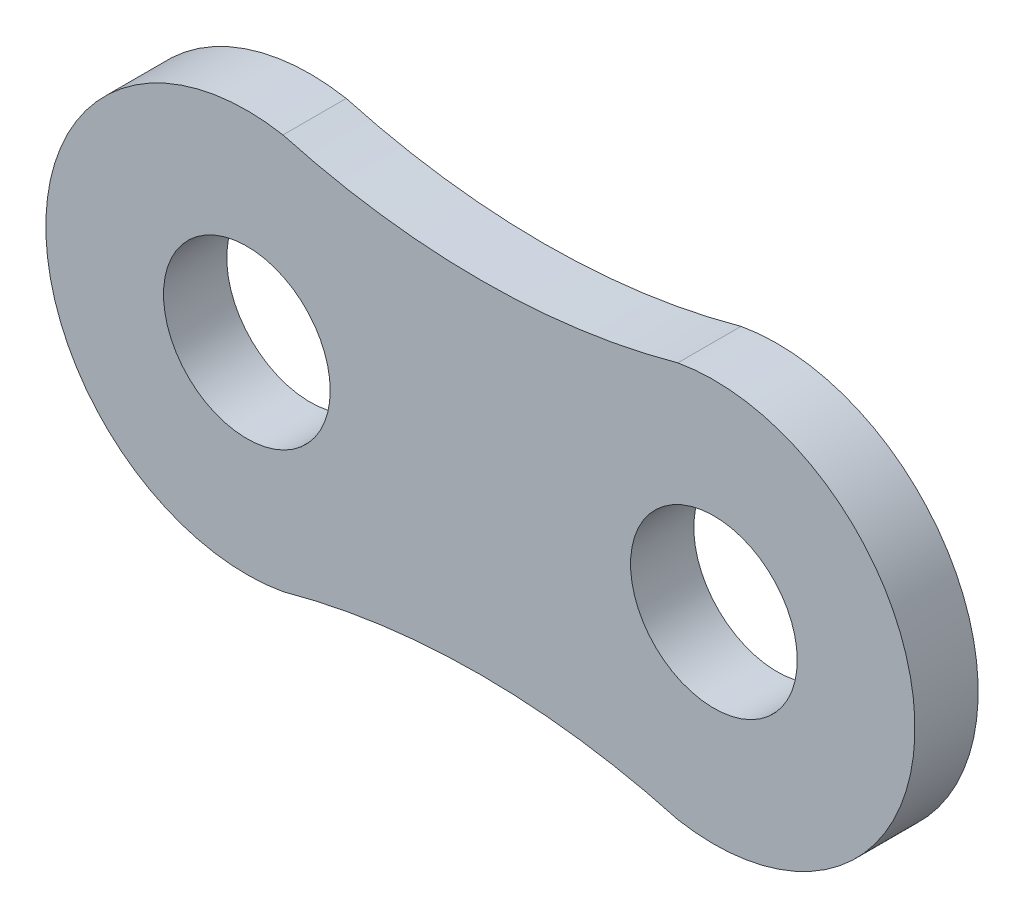
ISO-10303-21;
HEADER;
FILE_DESCRIPTION(('STEP AP214'),'2;1');
FILE_NAME('part.step','',(''),(''),'','','');
FILE_SCHEMA(('AUTOMOTIVE_DESIGN { 1 0 10303 214 1 1 1 1 }'));
ENDSEC;
DATA;
#1=APPLICATION_CONTEXT('core data for automotive mechanical design processes');
#2=APPLICATION_PROTOCOL_DEFINITION('international standard','automotive_design',2000,#1);
#3=PRODUCT_CONTEXT('',#1,'mechanical');
#4=PRODUCT('Part','Part','',(#3));
#5=PRODUCT_RELATED_PRODUCT_CATEGORY('part','',(#4));
#6=PRODUCT_DEFINITION_FORMATION('','',#4);
#7=PRODUCT_DEFINITION_CONTEXT('part definition',#1,'design');
#8=PRODUCT_DEFINITION('design','',#6,#7);
#9=PRODUCT_DEFINITION_SHAPE('','',#8);
#10=(LENGTH_UNIT() NAMED_UNIT(*) SI_UNIT(.MILLI.,.METRE.));
#11=(NAMED_UNIT(*) PLANE_ANGLE_UNIT() SI_UNIT($,.RADIAN.));
#12=(NAMED_UNIT(*) SI_UNIT($,.STERADIAN.) SOLID_ANGLE_UNIT());
#13=UNCERTAINTY_MEASURE_WITH_UNIT(LENGTH_MEASURE(1.E-05),#10,'distance_accuracy_value','');
#14=(GEOMETRIC_REPRESENTATION_CONTEXT(3) GLOBAL_UNCERTAINTY_ASSIGNED_CONTEXT((#13)) GLOBAL_UNIT_ASSIGNED_CONTEXT((#10,
#11,#12)) REPRESENTATION_CONTEXT('',''));
#15=CARTESIAN_POINT('',(0.,0.,0.));
#16=DIRECTION('',(0.,0.,1.));
#17=DIRECTION('',(1.,0.,0.));
#18=AXIS2_PLACEMENT_3D('',#15,#16,#17);
#19=CARTESIAN_POINT('',(4.025961325029,-4.033300234333,-4.15));
#20=DIRECTION('',(0.,0.,1.));
#21=DIRECTION('',(1.,0.,0.));
#22=AXIS2_PLACEMENT_3D('',#19,#20,#21);
#23=PLANE('',#22);
#24=CARTESIAN_POINT('',(-4.7625,0.,-4.15));
#25=DIRECTION('',(0.,0.,1.));
#26=DIRECTION('',(1.,0.,0.));
#27=AXIS2_PLACEMENT_3D('',#24,#25,#26);
#28=CIRCLE('',#27,1.7);
#29=CARTESIAN_POINT('',(-3.0625,0.,-4.15));
#30=VERTEX_POINT('',#29);
#31=EDGE_CURVE('E118',#30,#30,#28,.T.);
#32=ORIENTED_EDGE('',*,*,#31,.T.);
#33=EDGE_LOOP('',(#32));
#34=FACE_BOUND('',#33,.T.);
#35=CARTESIAN_POINT('',(4.7625,0.,-4.15));
#36=DIRECTION('',(0.,0.,1.));
#37=DIRECTION('',(1.,0.,0.));
#38=AXIS2_PLACEMENT_3D('',#35,#36,#37);
#39=CIRCLE('',#38,1.7);
#40=CARTESIAN_POINT('',(6.4625,0.,-4.15));
#41=VERTEX_POINT('',#40);
#42=EDGE_CURVE('E88',#41,#41,#39,.T.);
#43=ORIENTED_EDGE('',*,*,#42,.T.);
#44=EDGE_LOOP('',(#43));
#45=FACE_BOUND('',#44,.T.);
#46=CARTESIAN_POINT('',(-4.7625,0.,-4.15));
#47=DIRECTION('',(0.,0.,1.));
#48=DIRECTION('',(1.,0.,0.));
#49=AXIS2_PLACEMENT_3D('',#46,#47,#48);
#50=CIRCLE('',#49,4.1);
#51=CARTESIAN_POINT('',(-4.02596132500836,4.03330023432939,-4.15));
#52=VERTEX_POINT('',#51);
#53=CARTESIAN_POINT('',(-4.02596132505139,-4.03330023433415,-4.15));
#54=VERTEX_POINT('',#53);
#55=EDGE_CURVE('E80',#52,#54,#50,.T.);
#56=ORIENTED_EDGE('',*,*,#55,.F.);
#57=CARTESIAN_POINT('',(-3.241851231905E-13,18.547765210198,-4.15));
#58=DIRECTION('',(0.,0.,1.));
#59=DIRECTION('',(1.,0.,0.));
#60=AXIS2_PLACEMENT_3D('',#57,#58,#59);
#61=CIRCLE('',#60,15.062471846485);
#62=CARTESIAN_POINT('',(4.02596132500672,4.03330023432994,-4.15));
#63=VERTEX_POINT('',#62);
#64=EDGE_CURVE('E68',#52,#63,#61,.T.);
#65=ORIENTED_EDGE('',*,*,#64,.T.);
#66=CARTESIAN_POINT('',(4.7625,0.,-4.15));
#67=DIRECTION('',(0.,0.,1.));
#68=DIRECTION('',(1.,0.,0.));
#69=AXIS2_PLACEMENT_3D('',#66,#67,#68);
#70=CIRCLE('',#69,4.1);
#71=CARTESIAN_POINT('',(4.02596132505441,-4.03330023433516,-4.15));
#72=VERTEX_POINT('',#71);
#73=EDGE_CURVE('E19',#72,#63,#70,.T.);
#74=ORIENTED_EDGE('',*,*,#73,.F.);
#75=CARTESIAN_POINT('',(-3.233650580253E-13,-18.54776521019,-4.15));
#76=DIRECTION('',(0.,0.,1.));
#77=DIRECTION('',(1.,0.,0.));
#78=AXIS2_PLACEMENT_3D('',#75,#76,#77);
#79=CIRCLE('',#78,15.062471846485);
#80=EDGE_CURVE('E67',#72,#54,#79,.T.);
#81=ORIENTED_EDGE('',*,*,#80,.T.);
#82=EDGE_LOOP('',(#56,#65,#74,#81));
#83=FACE_BOUND('',#82,.T.);
#84=ADVANCED_FACE('F16',(#34,#45,#83),#23,.F.);
#85=CARTESIAN_POINT('',(4.7625,0.,-2.86));
#86=DIRECTION('',(0.,0.,1.));
#87=DIRECTION('',(1.,0.,0.));
#88=AXIS2_PLACEMENT_3D('',#85,#86,#87);
#89=CYLINDRICAL_SURFACE('',#88,4.1);
#90=DIRECTION('',(0.,0.,1.));
#91=VECTOR('',#90,1.);
#92=CARTESIAN_POINT('',(4.02596132501561,4.0333002343324,-2.86));
#93=LINE('',#92,#91);
#94=CARTESIAN_POINT('',(4.02596132500672,4.03330023432994,-2.86));
#95=VERTEX_POINT('',#94);
#96=EDGE_CURVE('E96',#63,#95,#93,.T.);
#97=ORIENTED_EDGE('',*,*,#96,.T.);
#98=CARTESIAN_POINT('',(4.7625,0.,-2.86));
#99=DIRECTION('',(0.,0.,1.));
#100=DIRECTION('',(1.,0.,0.));
#101=AXIS2_PLACEMENT_3D('',#98,#99,#100);
#102=CIRCLE('',#101,4.1);
#103=CARTESIAN_POINT('',(4.02596132505441,-4.03330023433516,-2.86));
#104=VERTEX_POINT('',#103);
#105=EDGE_CURVE('E76',#104,#95,#102,.T.);
#106=ORIENTED_EDGE('',*,*,#105,.F.);
#107=DIRECTION('',(0.,0.,1.));
#108=VECTOR('',#107,1.);
#109=CARTESIAN_POINT('',(4.02596132502654,-4.03330023432744,-2.86));
#110=LINE('',#109,#108);
#111=EDGE_CURVE('E73',#104,#72,#110,.F.);
#112=ORIENTED_EDGE('',*,*,#111,.T.);
#113=ORIENTED_EDGE('',*,*,#73,.T.);
#114=EDGE_LOOP('',(#97,#106,#112,#113));
#115=FACE_BOUND('',#114,.T.);
#116=ADVANCED_FACE('F74',(#115),#89,.T.);
#117=CARTESIAN_POINT('',(-3.241851231905E-13,18.547765210198,-2.86));
#118=DIRECTION('',(0.,0.,1.));
#119=DIRECTION('',(1.,0.,0.));
#120=AXIS2_PLACEMENT_3D('',#117,#118,#119);
#121=CYLINDRICAL_SURFACE('',#120,15.062471846485);
#122=ORIENTED_EDGE('',*,*,#96,.F.);
#123=ORIENTED_EDGE('',*,*,#64,.F.);
#124=DIRECTION('',(0.,0.,1.));
#125=VECTOR('',#124,1.);
#126=CARTESIAN_POINT('',(-4.025961325017,4.03330023433097,-2.86));
#127=LINE('',#126,#125);
#128=CARTESIAN_POINT('',(-4.02596132500837,4.0333002343294,-2.86));
#129=VERTEX_POINT('',#128);
#130=EDGE_CURVE('E94',#129,#52,#127,.F.);
#131=ORIENTED_EDGE('',*,*,#130,.F.);
#132=CARTESIAN_POINT('',(-3.241851231905E-13,18.547765210198,-2.86));
#133=DIRECTION('',(0.,0.,1.));
#134=DIRECTION('',(1.,0.,0.));
#135=AXIS2_PLACEMENT_3D('',#132,#133,#134);
#136=CIRCLE('',#135,15.062471846485);
#137=EDGE_CURVE('E114',#95,#129,#136,.F.);
#138=ORIENTED_EDGE('',*,*,#137,.F.);
#139=EDGE_LOOP('',(#122,#123,#131,#138));
#140=FACE_BOUND('',#139,.T.);
#141=ADVANCED_FACE('F142',(#140),#121,.F.);
#142=CARTESIAN_POINT('',(-4.7625,0.,-2.86));
#143=DIRECTION('',(0.,0.,1.));
#144=DIRECTION('',(1.,0.,0.));
#145=AXIS2_PLACEMENT_3D('',#142,#143,#144);
#146=CYLINDRICAL_SURFACE('',#145,4.1);
#147=DIRECTION('',(0.,0.,1.));
#148=VECTOR('',#147,1.);
#149=CARTESIAN_POINT('',(-4.02596132501865,-4.03330023432506,-2.86));
#150=LINE('',#149,#148);
#151=CARTESIAN_POINT('',(-4.02596132505139,-4.03330023433415,-2.86));
#152=VERTEX_POINT('',#151);
#153=EDGE_CURVE('E38',#54,#152,#150,.T.);
#154=ORIENTED_EDGE('',*,*,#153,.T.);
#155=CARTESIAN_POINT('',(-4.7625,0.,-2.86));
#156=DIRECTION('',(0.,0.,1.));
#157=DIRECTION('',(1.,0.,0.));
#158=AXIS2_PLACEMENT_3D('',#155,#156,#157);
#159=CIRCLE('',#158,4.1);
#160=EDGE_CURVE('E110',#129,#152,#159,.T.);
#161=ORIENTED_EDGE('',*,*,#160,.F.);
#162=ORIENTED_EDGE('',*,*,#130,.T.);
#163=ORIENTED_EDGE('',*,*,#55,.T.);
#164=EDGE_LOOP('',(#154,#161,#162,#163));
#165=FACE_BOUND('',#164,.T.);
#166=ADVANCED_FACE('F140',(#165),#146,.T.);
#167=CARTESIAN_POINT('',(-3.233650580253E-13,-18.54776521019,-2.86));
#168=DIRECTION('',(0.,0.,1.));
#169=DIRECTION('',(1.,0.,0.));
#170=AXIS2_PLACEMENT_3D('',#167,#168,#169);
#171=CYLINDRICAL_SURFACE('',#170,15.062471846485);
#172=ORIENTED_EDGE('',*,*,#153,.F.);
#173=ORIENTED_EDGE('',*,*,#80,.F.);
#174=ORIENTED_EDGE('',*,*,#111,.F.);
#175=CARTESIAN_POINT('',(-3.233650580253E-13,-18.54776521019,-2.86));
#176=DIRECTION('',(0.,0.,1.));
#177=DIRECTION('',(1.,0.,0.));
#178=AXIS2_PLACEMENT_3D('',#175,#176,#177);
#179=CIRCLE('',#178,15.062471846485);
#180=EDGE_CURVE('E108',#152,#104,#179,.F.);
#181=ORIENTED_EDGE('',*,*,#180,.F.);
#182=EDGE_LOOP('',(#172,#173,#174,#181));
#183=FACE_BOUND('',#182,.T.);
#184=ADVANCED_FACE('F82',(#183),#171,.F.);
#185=CARTESIAN_POINT('',(4.7625,0.,-2.86));
#186=DIRECTION('',(0.,0.,1.));
#187=DIRECTION('',(1.,0.,0.));
#188=AXIS2_PLACEMENT_3D('',#185,#186,#187);
#189=CYLINDRICAL_SURFACE('',#188,1.7);
#190=ORIENTED_EDGE('',*,*,#42,.F.);
#191=EDGE_LOOP('',(#190));
#192=FACE_BOUND('',#191,.T.);
#193=CARTESIAN_POINT('',(4.7625,0.,-2.86));
#194=DIRECTION('',(0.,0.,1.));
#195=DIRECTION('',(1.,0.,0.));
#196=AXIS2_PLACEMENT_3D('',#193,#194,#195);
#197=CIRCLE('',#196,1.7);
#198=CARTESIAN_POINT('',(6.4625,0.,-2.86));
#199=VERTEX_POINT('',#198);
#200=EDGE_CURVE('E26',#199,#199,#197,.F.);
#201=ORIENTED_EDGE('',*,*,#200,.F.);
#202=EDGE_LOOP('',(#201));
#203=FACE_BOUND('',#202,.T.);
#204=ADVANCED_FACE('F128',(#192,#203),#189,.F.);
#205=CARTESIAN_POINT('',(-4.7625,0.,-2.86));
#206=DIRECTION('',(0.,0.,1.));
#207=DIRECTION('',(1.,0.,0.));
#208=AXIS2_PLACEMENT_3D('',#205,#206,#207);
#209=CYLINDRICAL_SURFACE('',#208,1.7);
#210=ORIENTED_EDGE('',*,*,#31,.F.);
#211=EDGE_LOOP('',(#210));
#212=FACE_BOUND('',#211,.T.);
#213=CARTESIAN_POINT('',(-4.7625,0.,-2.86));
#214=DIRECTION('',(0.,0.,1.));
#215=DIRECTION('',(1.,0.,0.));
#216=AXIS2_PLACEMENT_3D('',#213,#214,#215);
#217=CIRCLE('',#216,1.7);
#218=CARTESIAN_POINT('',(-3.0625,0.,-2.86));
#219=VERTEX_POINT('',#218);
#220=EDGE_CURVE('E11',#219,#219,#217,.F.);
#221=ORIENTED_EDGE('',*,*,#220,.F.);
#222=EDGE_LOOP('',(#221));
#223=FACE_BOUND('',#222,.T.);
#224=ADVANCED_FACE('F131',(#212,#223),#209,.F.);
#225=CARTESIAN_POINT('',(4.025961325029,-4.033300234333,-2.86));
#226=DIRECTION('',(0.,0.,1.));
#227=DIRECTION('',(1.,0.,0.));
#228=AXIS2_PLACEMENT_3D('',#225,#226,#227);
#229=PLANE('',#228);
#230=ORIENTED_EDGE('',*,*,#220,.T.);
#231=EDGE_LOOP('',(#230));
#232=FACE_BOUND('',#231,.T.);
#233=ORIENTED_EDGE('',*,*,#200,.T.);
#234=EDGE_LOOP('',(#233));
#235=FACE_BOUND('',#234,.T.);
#236=ORIENTED_EDGE('',*,*,#160,.T.);
#237=ORIENTED_EDGE('',*,*,#180,.T.);
#238=ORIENTED_EDGE('',*,*,#105,.T.);
#239=ORIENTED_EDGE('',*,*,#137,.T.);
#240=EDGE_LOOP('',(#236,#237,#238,#239));
#241=FACE_BOUND('',#240,.T.);
#242=ADVANCED_FACE('F135',(#232,#235,#241),#229,.T.);
#243=CLOSED_SHELL('',(#84,#116,#141,#166,#184,#204,#224,#242));
#244=MANIFOLD_SOLID_BREP('B1',#243);
#245=ADVANCED_BREP_SHAPE_REPRESENTATION('',(#18,#244),#14);
#246=SHAPE_DEFINITION_REPRESENTATION(#9,#245);
ENDSEC;
END-ISO-10303-21;
